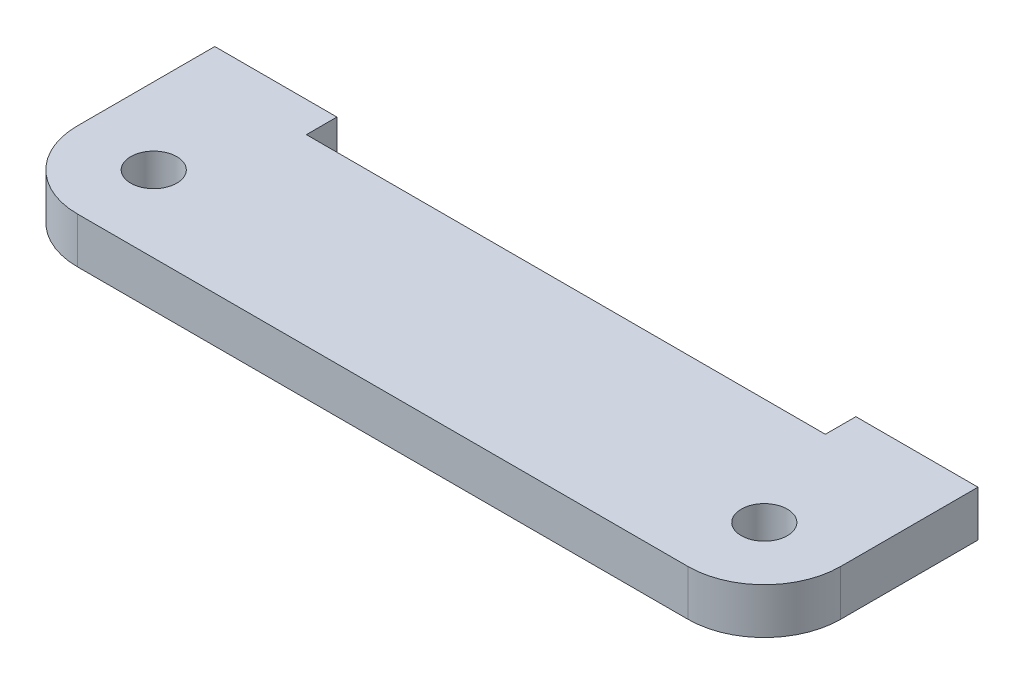
ISO-10303-21;
HEADER;
FILE_DESCRIPTION(('STEP AP214'),'2;1');
FILE_NAME('part.step','',(''),(''),'','','');
FILE_SCHEMA(('AUTOMOTIVE_DESIGN { 1 0 10303 214 1 1 1 1 }'));
ENDSEC;
DATA;
#1=APPLICATION_CONTEXT('core data for automotive mechanical design processes');
#2=APPLICATION_PROTOCOL_DEFINITION('international standard','automotive_design',2000,#1);
#3=PRODUCT_CONTEXT('',#1,'mechanical');
#4=PRODUCT('Part','Part','',(#3));
#5=PRODUCT_RELATED_PRODUCT_CATEGORY('part','',(#4));
#6=PRODUCT_DEFINITION_FORMATION('','',#4);
#7=PRODUCT_DEFINITION_CONTEXT('part definition',#1,'design');
#8=PRODUCT_DEFINITION('design','',#6,#7);
#9=PRODUCT_DEFINITION_SHAPE('','',#8);
#10=(LENGTH_UNIT() NAMED_UNIT(*) SI_UNIT(.MILLI.,.METRE.));
#11=(NAMED_UNIT(*) PLANE_ANGLE_UNIT() SI_UNIT($,.RADIAN.));
#12=(NAMED_UNIT(*) SI_UNIT($,.STERADIAN.) SOLID_ANGLE_UNIT());
#13=UNCERTAINTY_MEASURE_WITH_UNIT(LENGTH_MEASURE(1.E-05),#10,'distance_accuracy_value','');
#14=(GEOMETRIC_REPRESENTATION_CONTEXT(3) GLOBAL_UNCERTAINTY_ASSIGNED_CONTEXT((#13)) GLOBAL_UNIT_ASSIGNED_CONTEXT((#10,
#11,#12)) REPRESENTATION_CONTEXT('',''));
#15=CARTESIAN_POINT('',(0.,0.,0.));
#16=DIRECTION('',(0.,0.,1.));
#17=DIRECTION('',(1.,0.,0.));
#18=AXIS2_PLACEMENT_3D('',#15,#16,#17);
#19=CARTESIAN_POINT('',(25.,3.,-14.));
#20=DIRECTION('',(-1.,0.,0.));
#21=DIRECTION('',(0.,0.,1.));
#22=AXIS2_PLACEMENT_3D('',#19,#20,#21);
#23=PLANE('',#22);
#24=DIRECTION('',(0.,0.,-1.));
#25=VECTOR('',#24,1.);
#26=CARTESIAN_POINT('',(25.,3.,-14.));
#27=LINE('',#26,#25);
#28=CARTESIAN_POINT('',(25.,3.,-5.));
#29=VERTEX_POINT('',#28);
#30=CARTESIAN_POINT('',(25.,3.,-14.));
#31=VERTEX_POINT('',#30);
#32=EDGE_CURVE('E112',#29,#31,#27,.T.);
#33=ORIENTED_EDGE('',*,*,#32,.F.);
#34=DIRECTION('',(0.,-1.,0.));
#35=VECTOR('',#34,1.);
#36=CARTESIAN_POINT('',(25.,3.,-5.));
#37=LINE('',#36,#35);
#38=CARTESIAN_POINT('',(25.,0.,-5.));
#39=VERTEX_POINT('',#38);
#40=EDGE_CURVE('E11',#29,#39,#37,.T.);
#41=ORIENTED_EDGE('',*,*,#40,.T.);
#42=DIRECTION('',(0.,0.,-1.));
#43=VECTOR('',#42,1.);
#44=CARTESIAN_POINT('',(25.,0.,-14.));
#45=LINE('',#44,#43);
#46=CARTESIAN_POINT('',(25.,0.,-14.));
#47=VERTEX_POINT('',#46);
#48=EDGE_CURVE('E132',#39,#47,#45,.T.);
#49=ORIENTED_EDGE('',*,*,#48,.T.);
#50=DIRECTION('',(0.,-1.,0.));
#51=VECTOR('',#50,1.);
#52=CARTESIAN_POINT('',(25.,3.,-14.));
#53=LINE('',#52,#51);
#54=EDGE_CURVE('E125',#31,#47,#53,.T.);
#55=ORIENTED_EDGE('',*,*,#54,.F.);
#56=EDGE_LOOP('',(#33,#41,#49,#55));
#57=FACE_BOUND('',#56,.T.);
#58=ADVANCED_FACE('F35',(#57),#23,.F.);
#59=CARTESIAN_POINT('',(17.,3.,-14.));
#60=DIRECTION('',(0.,0.,1.));
#61=DIRECTION('',(1.,0.,0.));
#62=AXIS2_PLACEMENT_3D('',#59,#60,#61);
#63=PLANE('',#62);
#64=DIRECTION('',(-1.,0.,0.));
#65=VECTOR('',#64,1.);
#66=CARTESIAN_POINT('',(17.,0.,-14.));
#67=LINE('',#66,#65);
#68=CARTESIAN_POINT('',(17.,0.,-14.));
#69=VERTEX_POINT('',#68);
#70=EDGE_CURVE('E198',#47,#69,#67,.T.);
#71=ORIENTED_EDGE('',*,*,#70,.T.);
#72=DIRECTION('',(0.,-1.,0.));
#73=VECTOR('',#72,1.);
#74=CARTESIAN_POINT('',(17.,3.,-14.));
#75=LINE('',#74,#73);
#76=CARTESIAN_POINT('',(17.,3.,-14.));
#77=VERTEX_POINT('',#76);
#78=EDGE_CURVE('E127',#77,#69,#75,.T.);
#79=ORIENTED_EDGE('',*,*,#78,.F.);
#80=DIRECTION('',(-1.,0.,0.));
#81=VECTOR('',#80,1.);
#82=CARTESIAN_POINT('',(17.,3.,-14.));
#83=LINE('',#82,#81);
#84=EDGE_CURVE('E115',#31,#77,#83,.T.);
#85=ORIENTED_EDGE('',*,*,#84,.F.);
#86=ORIENTED_EDGE('',*,*,#54,.T.);
#87=EDGE_LOOP('',(#71,#79,#85,#86));
#88=FACE_BOUND('',#87,.T.);
#89=ADVANCED_FACE('F124',(#88),#63,.F.);
#90=CARTESIAN_POINT('',(17.,3.,-12.));
#91=DIRECTION('',(1.,0.,0.));
#92=DIRECTION('',(0.,0.,-1.));
#93=AXIS2_PLACEMENT_3D('',#90,#91,#92);
#94=PLANE('',#93);
#95=DIRECTION('',(0.,0.,1.));
#96=VECTOR('',#95,1.);
#97=CARTESIAN_POINT('',(17.,0.,-12.));
#98=LINE('',#97,#96);
#99=CARTESIAN_POINT('',(17.,0.,-12.));
#100=VERTEX_POINT('',#99);
#101=EDGE_CURVE('E196',#69,#100,#98,.T.);
#102=ORIENTED_EDGE('',*,*,#101,.T.);
#103=DIRECTION('',(0.,-1.,0.));
#104=VECTOR('',#103,1.);
#105=CARTESIAN_POINT('',(17.,3.,-12.));
#106=LINE('',#105,#104);
#107=CARTESIAN_POINT('',(17.,3.,-12.));
#108=VERTEX_POINT('',#107);
#109=EDGE_CURVE('E138',#108,#100,#106,.T.);
#110=ORIENTED_EDGE('',*,*,#109,.F.);
#111=DIRECTION('',(0.,0.,1.));
#112=VECTOR('',#111,1.);
#113=CARTESIAN_POINT('',(17.,3.,-12.));
#114=LINE('',#113,#112);
#115=EDGE_CURVE('E129',#77,#108,#114,.T.);
#116=ORIENTED_EDGE('',*,*,#115,.F.);
#117=ORIENTED_EDGE('',*,*,#78,.T.);
#118=EDGE_LOOP('',(#102,#110,#116,#117));
#119=FACE_BOUND('',#118,.T.);
#120=ADVANCED_FACE('F248',(#119),#94,.F.);
#121=CARTESIAN_POINT('',(-17.,3.,-12.));
#122=DIRECTION('',(0.,0.,1.));
#123=DIRECTION('',(1.,0.,0.));
#124=AXIS2_PLACEMENT_3D('',#121,#122,#123);
#125=PLANE('',#124);
#126=DIRECTION('',(-1.,0.,0.));
#127=VECTOR('',#126,1.);
#128=CARTESIAN_POINT('',(-17.,0.,-12.));
#129=LINE('',#128,#127);
#130=CARTESIAN_POINT('',(-17.,0.,-12.));
#131=VERTEX_POINT('',#130);
#132=EDGE_CURVE('E191',#100,#131,#129,.T.);
#133=ORIENTED_EDGE('',*,*,#132,.T.);
#134=DIRECTION('',(0.,-1.,0.));
#135=VECTOR('',#134,1.);
#136=CARTESIAN_POINT('',(-17.,3.,-12.));
#137=LINE('',#136,#135);
#138=CARTESIAN_POINT('',(-17.,3.,-12.));
#139=VERTEX_POINT('',#138);
#140=EDGE_CURVE('E182',#139,#131,#137,.T.);
#141=ORIENTED_EDGE('',*,*,#140,.F.);
#142=DIRECTION('',(-1.,0.,0.));
#143=VECTOR('',#142,1.);
#144=CARTESIAN_POINT('',(-17.,3.,-12.));
#145=LINE('',#144,#143);
#146=EDGE_CURVE('E192',#108,#139,#145,.T.);
#147=ORIENTED_EDGE('',*,*,#146,.F.);
#148=ORIENTED_EDGE('',*,*,#109,.T.);
#149=EDGE_LOOP('',(#133,#141,#147,#148));
#150=FACE_BOUND('',#149,.T.);
#151=ADVANCED_FACE('F189',(#150),#125,.F.);
#152=CARTESIAN_POINT('',(-17.,3.,-14.));
#153=DIRECTION('',(-1.,0.,0.));
#154=DIRECTION('',(0.,0.,1.));
#155=AXIS2_PLACEMENT_3D('',#152,#153,#154);
#156=PLANE('',#155);
#157=DIRECTION('',(0.,0.,-1.));
#158=VECTOR('',#157,1.);
#159=CARTESIAN_POINT('',(-17.,0.,-14.));
#160=LINE('',#159,#158);
#161=CARTESIAN_POINT('',(-17.,0.,-14.));
#162=VERTEX_POINT('',#161);
#163=EDGE_CURVE('E174',#131,#162,#160,.T.);
#164=ORIENTED_EDGE('',*,*,#163,.T.);
#165=DIRECTION('',(0.,-1.,0.));
#166=VECTOR('',#165,1.);
#167=CARTESIAN_POINT('',(-17.,3.,-14.));
#168=LINE('',#167,#166);
#169=CARTESIAN_POINT('',(-17.,3.,-14.));
#170=VERTEX_POINT('',#169);
#171=EDGE_CURVE('E179',#170,#162,#168,.T.);
#172=ORIENTED_EDGE('',*,*,#171,.F.);
#173=DIRECTION('',(0.,0.,-1.));
#174=VECTOR('',#173,1.);
#175=CARTESIAN_POINT('',(-17.,3.,-14.));
#176=LINE('',#175,#174);
#177=EDGE_CURVE('E207',#139,#170,#176,.T.);
#178=ORIENTED_EDGE('',*,*,#177,.F.);
#179=ORIENTED_EDGE('',*,*,#140,.T.);
#180=EDGE_LOOP('',(#164,#172,#178,#179));
#181=FACE_BOUND('',#180,.T.);
#182=ADVANCED_FACE('F261',(#181),#156,.F.);
#183=CARTESIAN_POINT('',(-25.,3.,-14.));
#184=DIRECTION('',(0.,0.,1.));
#185=DIRECTION('',(1.,0.,0.));
#186=AXIS2_PLACEMENT_3D('',#183,#184,#185);
#187=PLANE('',#186);
#188=DIRECTION('',(-1.,0.,0.));
#189=VECTOR('',#188,1.);
#190=CARTESIAN_POINT('',(-25.,0.,-14.));
#191=LINE('',#190,#189);
#192=CARTESIAN_POINT('',(-25.,0.,-14.));
#193=VERTEX_POINT('',#192);
#194=EDGE_CURVE('E171',#162,#193,#191,.T.);
#195=ORIENTED_EDGE('',*,*,#194,.T.);
#196=DIRECTION('',(0.,-1.,0.));
#197=VECTOR('',#196,1.);
#198=CARTESIAN_POINT('',(-25.,3.,-14.));
#199=LINE('',#198,#197);
#200=CARTESIAN_POINT('',(-25.,3.,-14.));
#201=VERTEX_POINT('',#200);
#202=EDGE_CURVE('E160',#201,#193,#199,.T.);
#203=ORIENTED_EDGE('',*,*,#202,.F.);
#204=DIRECTION('',(-1.,0.,0.));
#205=VECTOR('',#204,1.);
#206=CARTESIAN_POINT('',(-25.,3.,-14.));
#207=LINE('',#206,#205);
#208=EDGE_CURVE('E205',#170,#201,#207,.T.);
#209=ORIENTED_EDGE('',*,*,#208,.F.);
#210=ORIENTED_EDGE('',*,*,#171,.T.);
#211=EDGE_LOOP('',(#195,#203,#209,#210));
#212=FACE_BOUND('',#211,.T.);
#213=ADVANCED_FACE('F264',(#212),#187,.F.);
#214=CARTESIAN_POINT('',(-25.,3.,-14.));
#215=DIRECTION('',(1.,0.,0.));
#216=DIRECTION('',(0.,0.,-1.));
#217=AXIS2_PLACEMENT_3D('',#214,#215,#216);
#218=PLANE('',#217);
#219=DIRECTION('',(0.,0.,1.));
#220=VECTOR('',#219,1.);
#221=CARTESIAN_POINT('',(-25.,0.,-14.));
#222=LINE('',#221,#220);
#223=CARTESIAN_POINT('',(-25.,0.,-5.));
#224=VERTEX_POINT('',#223);
#225=EDGE_CURVE('E167',#193,#224,#222,.T.);
#226=ORIENTED_EDGE('',*,*,#225,.T.);
#227=DIRECTION('',(0.,-1.,0.));
#228=VECTOR('',#227,1.);
#229=CARTESIAN_POINT('',(-25.,3.,-5.));
#230=LINE('',#229,#228);
#231=CARTESIAN_POINT('',(-25.,3.,-5.));
#232=VERTEX_POINT('',#231);
#233=EDGE_CURVE('E58',#224,#232,#230,.F.);
#234=ORIENTED_EDGE('',*,*,#233,.T.);
#235=DIRECTION('',(0.,0.,1.));
#236=VECTOR('',#235,1.);
#237=CARTESIAN_POINT('',(-25.,3.,-14.));
#238=LINE('',#237,#236);
#239=EDGE_CURVE('E152',#201,#232,#238,.T.);
#240=ORIENTED_EDGE('',*,*,#239,.F.);
#241=ORIENTED_EDGE('',*,*,#202,.T.);
#242=EDGE_LOOP('',(#226,#234,#240,#241));
#243=FACE_BOUND('',#242,.T.);
#244=ADVANCED_FACE('F169',(#243),#218,.F.);
#245=CARTESIAN_POINT('',(-25.,3.,0.));
#246=DIRECTION('',(0.,0.,-1.));
#247=DIRECTION('',(-1.,0.,0.));
#248=AXIS2_PLACEMENT_3D('',#245,#246,#247);
#249=PLANE('',#248);
#250=DIRECTION('',(1.,0.,0.));
#251=VECTOR('',#250,1.);
#252=CARTESIAN_POINT('',(-25.,3.,0.));
#253=LINE('',#252,#251);
#254=CARTESIAN_POINT('',(-20.,3.,0.));
#255=VERTEX_POINT('',#254);
#256=CARTESIAN_POINT('',(20.,3.,0.));
#257=VERTEX_POINT('',#256);
#258=EDGE_CURVE('E151',#255,#257,#253,.T.);
#259=ORIENTED_EDGE('',*,*,#258,.F.);
#260=DIRECTION('',(0.,-1.,0.));
#261=VECTOR('',#260,1.);
#262=CARTESIAN_POINT('',(-20.,3.,0.));
#263=LINE('',#262,#261);
#264=CARTESIAN_POINT('',(-20.,0.,0.));
#265=VERTEX_POINT('',#264);
#266=EDGE_CURVE('E136',#255,#265,#263,.T.);
#267=ORIENTED_EDGE('',*,*,#266,.T.);
#268=DIRECTION('',(1.,0.,0.));
#269=VECTOR('',#268,1.);
#270=CARTESIAN_POINT('',(-25.,0.,0.));
#271=LINE('',#270,#269);
#272=CARTESIAN_POINT('',(20.,0.,0.));
#273=VERTEX_POINT('',#272);
#274=EDGE_CURVE('E120',#265,#273,#271,.T.);
#275=ORIENTED_EDGE('',*,*,#274,.T.);
#276=DIRECTION('',(0.,-1.,0.));
#277=VECTOR('',#276,1.);
#278=CARTESIAN_POINT('',(20.,3.,0.));
#279=LINE('',#278,#277);
#280=EDGE_CURVE('E134',#273,#257,#279,.F.);
#281=ORIENTED_EDGE('',*,*,#280,.T.);
#282=EDGE_LOOP('',(#259,#267,#275,#281));
#283=FACE_BOUND('',#282,.T.);
#284=ADVANCED_FACE('F156',(#283),#249,.F.);
#285=CARTESIAN_POINT('',(0.,3.,0.));
#286=DIRECTION('',(0.,1.,0.));
#287=DIRECTION('',(0.,0.,1.));
#288=AXIS2_PLACEMENT_3D('',#285,#286,#287);
#289=PLANE('',#288);
#290=CARTESIAN_POINT('',(20.,3.,-4.99999999999999));
#291=DIRECTION('',(0.,1.,0.));
#292=DIRECTION('',(0.,0.,1.));
#293=AXIS2_PLACEMENT_3D('',#290,#291,#292);
#294=CIRCLE('',#293,1.50999999999999);
#295=CARTESIAN_POINT('',(20.,3.,-3.49000000000001));
#296=VERTEX_POINT('',#295);
#297=EDGE_CURVE('E219',#296,#296,#294,.T.);
#298=ORIENTED_EDGE('',*,*,#297,.F.);
#299=EDGE_LOOP('',(#298));
#300=FACE_BOUND('',#299,.T.);
#301=CARTESIAN_POINT('',(-20.,3.,-4.99999999999999));
#302=DIRECTION('',(0.,1.,0.));
#303=DIRECTION('',(0.,0.,1.));
#304=AXIS2_PLACEMENT_3D('',#301,#302,#303);
#305=CIRCLE('',#304,1.50999999999999);
#306=CARTESIAN_POINT('',(-20.,3.,-3.49000000000001));
#307=VERTEX_POINT('',#306);
#308=EDGE_CURVE('E213',#307,#307,#305,.T.);
#309=ORIENTED_EDGE('',*,*,#308,.F.);
#310=EDGE_LOOP('',(#309));
#311=FACE_BOUND('',#310,.T.);
#312=ORIENTED_EDGE('',*,*,#239,.T.);
#313=CARTESIAN_POINT('',(-20.,3.,-5.));
#314=DIRECTION('',(0.,1.,0.));
#315=DIRECTION('',(0.,0.,1.));
#316=AXIS2_PLACEMENT_3D('',#313,#314,#315);
#317=CIRCLE('',#316,5.);
#318=EDGE_CURVE('E43',#232,#255,#317,.T.);
#319=ORIENTED_EDGE('',*,*,#318,.T.);
#320=ORIENTED_EDGE('',*,*,#258,.T.);
#321=CARTESIAN_POINT('',(20.,3.,-5.));
#322=DIRECTION('',(0.,1.,0.));
#323=DIRECTION('',(0.,0.,1.));
#324=AXIS2_PLACEMENT_3D('',#321,#322,#323);
#325=CIRCLE('',#324,5.);
#326=EDGE_CURVE('E50',#257,#29,#325,.T.);
#327=ORIENTED_EDGE('',*,*,#326,.T.);
#328=ORIENTED_EDGE('',*,*,#32,.T.);
#329=ORIENTED_EDGE('',*,*,#84,.T.);
#330=ORIENTED_EDGE('',*,*,#115,.T.);
#331=ORIENTED_EDGE('',*,*,#146,.T.);
#332=ORIENTED_EDGE('',*,*,#177,.T.);
#333=ORIENTED_EDGE('',*,*,#208,.T.);
#334=EDGE_LOOP('',(#312,#319,#320,#327,#328,#329,#330,#331,#332,#333));
#335=FACE_BOUND('',#334,.T.);
#336=ADVANCED_FACE('F114',(#300,#311,#335),#289,.T.);
#337=CARTESIAN_POINT('',(0.,0.,0.));
#338=DIRECTION('',(0.,1.,0.));
#339=DIRECTION('',(0.,0.,1.));
#340=AXIS2_PLACEMENT_3D('',#337,#338,#339);
#341=PLANE('',#340);
#342=CARTESIAN_POINT('',(20.,0.,-4.99999999999999));
#343=DIRECTION('',(0.,1.,0.));
#344=DIRECTION('',(0.,0.,1.));
#345=AXIS2_PLACEMENT_3D('',#342,#343,#344);
#346=CIRCLE('',#345,1.51);
#347=CARTESIAN_POINT('',(20.,0.,-3.49));
#348=VERTEX_POINT('',#347);
#349=EDGE_CURVE('E216',#348,#348,#346,.T.);
#350=ORIENTED_EDGE('',*,*,#349,.T.);
#351=EDGE_LOOP('',(#350));
#352=FACE_BOUND('',#351,.T.);
#353=CARTESIAN_POINT('',(-20.,0.,-4.99999999999999));
#354=DIRECTION('',(0.,1.,0.));
#355=DIRECTION('',(0.,0.,1.));
#356=AXIS2_PLACEMENT_3D('',#353,#354,#355);
#357=CIRCLE('',#356,1.51);
#358=CARTESIAN_POINT('',(-20.,0.,-3.49));
#359=VERTEX_POINT('',#358);
#360=EDGE_CURVE('E202',#359,#359,#357,.T.);
#361=ORIENTED_EDGE('',*,*,#360,.T.);
#362=EDGE_LOOP('',(#361));
#363=FACE_BOUND('',#362,.T.);
#364=ORIENTED_EDGE('',*,*,#274,.F.);
#365=CARTESIAN_POINT('',(-20.,0.,-5.));
#366=DIRECTION('',(0.,1.,0.));
#367=DIRECTION('',(0.,0.,1.));
#368=AXIS2_PLACEMENT_3D('',#365,#366,#367);
#369=CIRCLE('',#368,5.);
#370=EDGE_CURVE('E146',#265,#224,#369,.F.);
#371=ORIENTED_EDGE('',*,*,#370,.T.);
#372=ORIENTED_EDGE('',*,*,#225,.F.);
#373=ORIENTED_EDGE('',*,*,#194,.F.);
#374=ORIENTED_EDGE('',*,*,#163,.F.);
#375=ORIENTED_EDGE('',*,*,#132,.F.);
#376=ORIENTED_EDGE('',*,*,#101,.F.);
#377=ORIENTED_EDGE('',*,*,#70,.F.);
#378=ORIENTED_EDGE('',*,*,#48,.F.);
#379=CARTESIAN_POINT('',(20.,0.,-5.));
#380=DIRECTION('',(0.,1.,0.));
#381=DIRECTION('',(0.,0.,1.));
#382=AXIS2_PLACEMENT_3D('',#379,#380,#381);
#383=CIRCLE('',#382,5.);
#384=EDGE_CURVE('E144',#39,#273,#383,.F.);
#385=ORIENTED_EDGE('',*,*,#384,.T.);
#386=EDGE_LOOP('',(#364,#371,#372,#373,#374,#375,#376,#377,#378,#385));
#387=FACE_BOUND('',#386,.T.);
#388=ADVANCED_FACE('F165',(#352,#363,#387),#341,.F.);
#389=CARTESIAN_POINT('',(-20.,3.,-4.99999999999999));
#390=DIRECTION('',(0.,1.,0.));
#391=DIRECTION('',(0.,0.,1.));
#392=AXIS2_PLACEMENT_3D('',#389,#390,#391);
#393=CYLINDRICAL_SURFACE('',#392,1.50999999999999);
#394=ORIENTED_EDGE('',*,*,#360,.F.);
#395=EDGE_LOOP('',(#394));
#396=FACE_BOUND('',#395,.T.);
#397=ORIENTED_EDGE('',*,*,#308,.T.);
#398=EDGE_LOOP('',(#397));
#399=FACE_BOUND('',#398,.T.);
#400=ADVANCED_FACE('F230',(#396,#399),#393,.F.);
#401=CARTESIAN_POINT('',(20.,3.,-4.99999999999999));
#402=DIRECTION('',(0.,1.,0.));
#403=DIRECTION('',(0.,0.,1.));
#404=AXIS2_PLACEMENT_3D('',#401,#402,#403);
#405=CYLINDRICAL_SURFACE('',#404,1.50999999999999);
#406=ORIENTED_EDGE('',*,*,#349,.F.);
#407=EDGE_LOOP('',(#406));
#408=FACE_BOUND('',#407,.T.);
#409=ORIENTED_EDGE('',*,*,#297,.T.);
#410=EDGE_LOOP('',(#409));
#411=FACE_BOUND('',#410,.T.);
#412=ADVANCED_FACE('F223',(#408,#411),#405,.F.);
#413=CARTESIAN_POINT('',(-20.,3.,-5.));
#414=DIRECTION('',(0.,-1.,0.));
#415=DIRECTION('',(0.,0.,-1.));
#416=AXIS2_PLACEMENT_3D('',#413,#414,#415);
#417=CYLINDRICAL_SURFACE('',#416,5.);
#418=ORIENTED_EDGE('',*,*,#318,.F.);
#419=ORIENTED_EDGE('',*,*,#233,.F.);
#420=ORIENTED_EDGE('',*,*,#370,.F.);
#421=ORIENTED_EDGE('',*,*,#266,.F.);
#422=EDGE_LOOP('',(#418,#419,#420,#421));
#423=FACE_BOUND('',#422,.T.);
#424=ADVANCED_FACE('F162',(#423),#417,.T.);
#425=CARTESIAN_POINT('',(20.,3.,-5.));
#426=DIRECTION('',(0.,-1.,0.));
#427=DIRECTION('',(0.,0.,-1.));
#428=AXIS2_PLACEMENT_3D('',#425,#426,#427);
#429=CYLINDRICAL_SURFACE('',#428,5.);
#430=ORIENTED_EDGE('',*,*,#326,.F.);
#431=ORIENTED_EDGE('',*,*,#280,.F.);
#432=ORIENTED_EDGE('',*,*,#384,.F.);
#433=ORIENTED_EDGE('',*,*,#40,.F.);
#434=EDGE_LOOP('',(#430,#431,#432,#433));
#435=FACE_BOUND('',#434,.T.);
#436=ADVANCED_FACE('F37',(#435),#429,.T.);
#437=CLOSED_SHELL('',(#58,#89,#120,#151,#182,#213,#244,#284,#336,#388,#400,#412,#424,#436));
#438=MANIFOLD_SOLID_BREP('B2',#437);
#439=ADVANCED_BREP_SHAPE_REPRESENTATION('',(#18,#438),#14);
#440=SHAPE_DEFINITION_REPRESENTATION(#9,#439);
ENDSEC;
END-ISO-10303-21;
